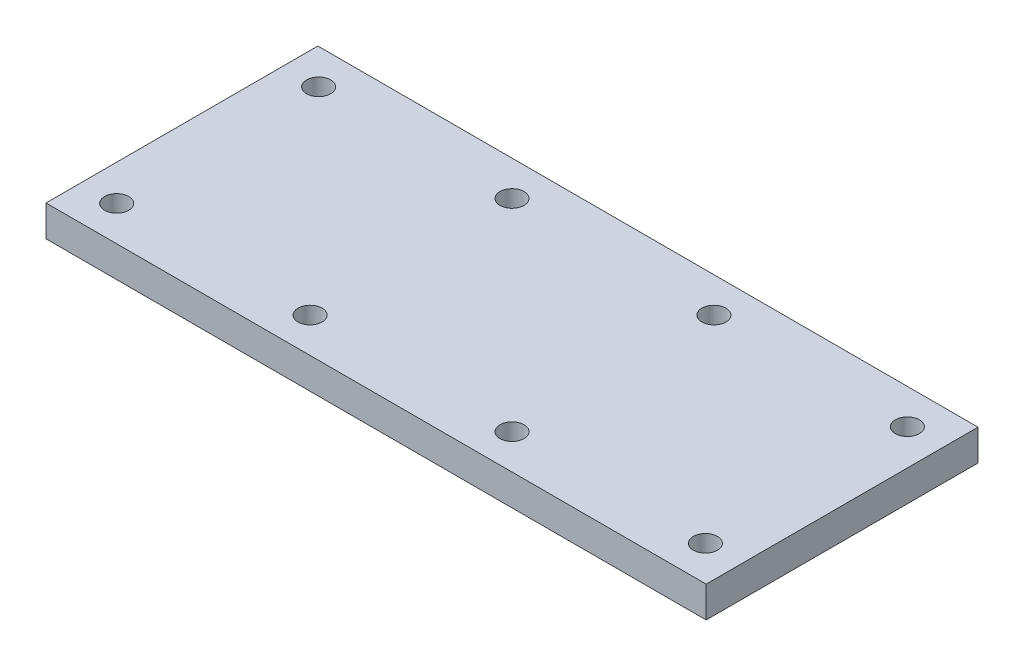
ISO-10303-21;
HEADER;
FILE_DESCRIPTION(('STEP AP214'),'2;1');
FILE_NAME('part.step','',(''),(''),'','','');
FILE_SCHEMA(('AUTOMOTIVE_DESIGN { 1 0 10303 214 1 1 1 1 }'));
ENDSEC;
DATA;
#1=APPLICATION_CONTEXT('core data for automotive mechanical design processes');
#2=APPLICATION_PROTOCOL_DEFINITION('international standard','automotive_design',2000,#1);
#3=PRODUCT_CONTEXT('',#1,'mechanical');
#4=PRODUCT('Part','Part','',(#3));
#5=PRODUCT_RELATED_PRODUCT_CATEGORY('part','',(#4));
#6=PRODUCT_DEFINITION_FORMATION('','',#4);
#7=PRODUCT_DEFINITION_CONTEXT('part definition',#1,'design');
#8=PRODUCT_DEFINITION('design','',#6,#7);
#9=PRODUCT_DEFINITION_SHAPE('','',#8);
#10=(LENGTH_UNIT() NAMED_UNIT(*) SI_UNIT(.MILLI.,.METRE.));
#11=(NAMED_UNIT(*) PLANE_ANGLE_UNIT() SI_UNIT($,.RADIAN.));
#12=(NAMED_UNIT(*) SI_UNIT($,.STERADIAN.) SOLID_ANGLE_UNIT());
#13=UNCERTAINTY_MEASURE_WITH_UNIT(LENGTH_MEASURE(1.E-05),#10,'distance_accuracy_value','');
#14=(GEOMETRIC_REPRESENTATION_CONTEXT(3) GLOBAL_UNCERTAINTY_ASSIGNED_CONTEXT((#13)) GLOBAL_UNIT_ASSIGNED_CONTEXT((#10,
#11,#12)) REPRESENTATION_CONTEXT('',''));
#15=CARTESIAN_POINT('',(0.,0.,0.));
#16=DIRECTION('',(0.,0.,1.));
#17=DIRECTION('',(1.,0.,0.));
#18=AXIS2_PLACEMENT_3D('',#15,#16,#17);
#19=CARTESIAN_POINT('',(0.,4.,0.));
#20=DIRECTION('',(0.,-1.,0.));
#21=DIRECTION('',(0.,0.,-1.));
#22=AXIS2_PLACEMENT_3D('',#19,#20,#21);
#23=PLANE('',#22);
#24=DIRECTION('',(0.,0.,1.));
#25=VECTOR('',#24,1.);
#26=CARTESIAN_POINT('',(0.,4.,0.));
#27=LINE('',#26,#25);
#28=CARTESIAN_POINT('',(0.,4.,-35.));
#29=VERTEX_POINT('',#28);
#30=CARTESIAN_POINT('',(0.,4.,0.));
#31=VERTEX_POINT('',#30);
#32=EDGE_CURVE('E92',#29,#31,#27,.T.);
#33=ORIENTED_EDGE('',*,*,#32,.T.);
#34=DIRECTION('',(1.,0.,0.));
#35=VECTOR('',#34,1.);
#36=CARTESIAN_POINT('',(0.,4.,0.));
#37=LINE('',#36,#35);
#38=CARTESIAN_POINT('',(85.,4.,0.));
#39=VERTEX_POINT('',#38);
#40=EDGE_CURVE('E87',#31,#39,#37,.T.);
#41=ORIENTED_EDGE('',*,*,#40,.T.);
#42=DIRECTION('',(0.,0.,-1.));
#43=VECTOR('',#42,1.);
#44=CARTESIAN_POINT('',(85.,4.,0.));
#45=LINE('',#44,#43);
#46=CARTESIAN_POINT('',(85.,4.,-35.));
#47=VERTEX_POINT('',#46);
#48=EDGE_CURVE('E90',#39,#47,#45,.T.);
#49=ORIENTED_EDGE('',*,*,#48,.T.);
#50=DIRECTION('',(-1.,0.,0.));
#51=VECTOR('',#50,1.);
#52=CARTESIAN_POINT('',(0.,4.,-35.));
#53=LINE('',#52,#51);
#54=EDGE_CURVE('E57',#47,#29,#53,.T.);
#55=ORIENTED_EDGE('',*,*,#54,.T.);
#56=EDGE_LOOP('',(#33,#41,#49,#55));
#57=FACE_BOUND('',#56,.T.);
#58=CARTESIAN_POINT('',(80.4,4.,-30.5));
#59=DIRECTION('',(0.,1.,0.));
#60=DIRECTION('',(0.,0.,1.));
#61=AXIS2_PLACEMENT_3D('',#58,#59,#60);
#62=CIRCLE('',#61,1.54999999999999);
#63=CARTESIAN_POINT('',(80.4,4.,-28.95));
#64=VERTEX_POINT('',#63);
#65=EDGE_CURVE('E112',#64,#64,#62,.T.);
#66=ORIENTED_EDGE('',*,*,#65,.F.);
#67=EDGE_LOOP('',(#66));
#68=FACE_BOUND('',#67,.T.);
#69=CARTESIAN_POINT('',(80.4,4.,-4.5));
#70=DIRECTION('',(0.,1.,0.));
#71=DIRECTION('',(0.,0.,-1.));
#72=AXIS2_PLACEMENT_3D('',#69,#70,#71);
#73=CIRCLE('',#72,1.54999999999999);
#74=CARTESIAN_POINT('',(80.4,4.,-6.05));
#75=VERTEX_POINT('',#74);
#76=EDGE_CURVE('E134',#75,#75,#73,.T.);
#77=ORIENTED_EDGE('',*,*,#76,.F.);
#78=EDGE_LOOP('',(#77));
#79=FACE_BOUND('',#78,.T.);
#80=CARTESIAN_POINT('',(4.60000000000001,4.,-30.5));
#81=DIRECTION('',(0.,1.,0.));
#82=DIRECTION('',(0.,0.,-1.));
#83=AXIS2_PLACEMENT_3D('',#80,#81,#82);
#84=CIRCLE('',#83,1.55);
#85=CARTESIAN_POINT('',(4.60000000000001,4.,-32.05));
#86=VERTEX_POINT('',#85);
#87=EDGE_CURVE('E142',#86,#86,#84,.T.);
#88=ORIENTED_EDGE('',*,*,#87,.F.);
#89=EDGE_LOOP('',(#88));
#90=FACE_BOUND('',#89,.T.);
#91=CARTESIAN_POINT('',(4.60000000000001,4.,-4.5));
#92=DIRECTION('',(0.,1.,0.));
#93=DIRECTION('',(0.,0.,1.));
#94=AXIS2_PLACEMENT_3D('',#91,#92,#93);
#95=CIRCLE('',#94,1.55);
#96=CARTESIAN_POINT('',(4.60000000000001,4.,-2.95));
#97=VERTEX_POINT('',#96);
#98=EDGE_CURVE('E150',#97,#97,#95,.T.);
#99=ORIENTED_EDGE('',*,*,#98,.F.);
#100=EDGE_LOOP('',(#99));
#101=FACE_BOUND('',#100,.T.);
#102=CARTESIAN_POINT('',(55.5,4.,-30.5));
#103=DIRECTION('',(0.,1.,0.));
#104=DIRECTION('',(0.,0.,1.));
#105=AXIS2_PLACEMENT_3D('',#102,#103,#104);
#106=CIRCLE('',#105,1.55);
#107=CARTESIAN_POINT('',(55.5,4.,-28.95));
#108=VERTEX_POINT('',#107);
#109=EDGE_CURVE('E158',#108,#108,#106,.T.);
#110=ORIENTED_EDGE('',*,*,#109,.F.);
#111=EDGE_LOOP('',(#110));
#112=FACE_BOUND('',#111,.T.);
#113=CARTESIAN_POINT('',(55.5,4.,-4.5));
#114=DIRECTION('',(0.,1.,0.));
#115=DIRECTION('',(0.,0.,-1.));
#116=AXIS2_PLACEMENT_3D('',#113,#114,#115);
#117=CIRCLE('',#116,1.55);
#118=CARTESIAN_POINT('',(55.5,4.,-6.05000000000001));
#119=VERTEX_POINT('',#118);
#120=EDGE_CURVE('E166',#119,#119,#117,.T.);
#121=ORIENTED_EDGE('',*,*,#120,.F.);
#122=EDGE_LOOP('',(#121));
#123=FACE_BOUND('',#122,.T.);
#124=CARTESIAN_POINT('',(29.5,4.,-4.5));
#125=DIRECTION('',(0.,1.,0.));
#126=DIRECTION('',(0.,0.,1.));
#127=AXIS2_PLACEMENT_3D('',#124,#125,#126);
#128=CIRCLE('',#127,1.55);
#129=CARTESIAN_POINT('',(29.5,4.,-2.95));
#130=VERTEX_POINT('',#129);
#131=EDGE_CURVE('E174',#130,#130,#128,.T.);
#132=ORIENTED_EDGE('',*,*,#131,.F.);
#133=EDGE_LOOP('',(#132));
#134=FACE_BOUND('',#133,.T.);
#135=CARTESIAN_POINT('',(29.5,4.,-30.5));
#136=DIRECTION('',(0.,1.,0.));
#137=DIRECTION('',(0.,0.,-1.));
#138=AXIS2_PLACEMENT_3D('',#135,#136,#137);
#139=CIRCLE('',#138,1.55);
#140=CARTESIAN_POINT('',(29.5,4.,-32.05));
#141=VERTEX_POINT('',#140);
#142=EDGE_CURVE('E182',#141,#141,#139,.T.);
#143=ORIENTED_EDGE('',*,*,#142,.F.);
#144=EDGE_LOOP('',(#143));
#145=FACE_BOUND('',#144,.T.);
#146=ADVANCED_FACE('F39',(#57,#68,#79,#90,#101,#112,#123,#134,#145),#23,.F.);
#147=CARTESIAN_POINT('',(0.,0.,0.));
#148=DIRECTION('',(0.,-1.,0.));
#149=DIRECTION('',(0.,0.,-1.));
#150=AXIS2_PLACEMENT_3D('',#147,#148,#149);
#151=PLANE('',#150);
#152=CARTESIAN_POINT('',(29.5,0.,-4.5));
#153=DIRECTION('',(0.,1.,0.));
#154=DIRECTION('',(0.,0.,1.));
#155=AXIS2_PLACEMENT_3D('',#152,#153,#154);
#156=CIRCLE('',#155,1.55);
#157=CARTESIAN_POINT('',(29.5,0.,-2.95));
#158=VERTEX_POINT('',#157);
#159=EDGE_CURVE('E178',#158,#158,#156,.T.);
#160=ORIENTED_EDGE('',*,*,#159,.T.);
#161=EDGE_LOOP('',(#160));
#162=FACE_BOUND('',#161,.T.);
#163=CARTESIAN_POINT('',(55.5,0.,-30.5));
#164=DIRECTION('',(0.,1.,0.));
#165=DIRECTION('',(0.,0.,1.));
#166=AXIS2_PLACEMENT_3D('',#163,#164,#165);
#167=CIRCLE('',#166,1.55);
#168=CARTESIAN_POINT('',(55.5,0.,-28.95));
#169=VERTEX_POINT('',#168);
#170=EDGE_CURVE('E162',#169,#169,#167,.T.);
#171=ORIENTED_EDGE('',*,*,#170,.T.);
#172=EDGE_LOOP('',(#171));
#173=FACE_BOUND('',#172,.T.);
#174=CARTESIAN_POINT('',(4.60000000000001,0.,-30.5));
#175=DIRECTION('',(0.,1.,0.));
#176=DIRECTION('',(0.,0.,-1.));
#177=AXIS2_PLACEMENT_3D('',#174,#175,#176);
#178=CIRCLE('',#177,1.55);
#179=CARTESIAN_POINT('',(4.60000000000001,0.,-32.05));
#180=VERTEX_POINT('',#179);
#181=EDGE_CURVE('E146',#180,#180,#178,.T.);
#182=ORIENTED_EDGE('',*,*,#181,.T.);
#183=EDGE_LOOP('',(#182));
#184=FACE_BOUND('',#183,.T.);
#185=CARTESIAN_POINT('',(80.4,0.,-30.5));
#186=DIRECTION('',(0.,1.,0.));
#187=DIRECTION('',(0.,0.,1.));
#188=AXIS2_PLACEMENT_3D('',#185,#186,#187);
#189=CIRCLE('',#188,1.54999999999999);
#190=CARTESIAN_POINT('',(80.4,0.,-28.95));
#191=VERTEX_POINT('',#190);
#192=EDGE_CURVE('E130',#191,#191,#189,.T.);
#193=ORIENTED_EDGE('',*,*,#192,.T.);
#194=EDGE_LOOP('',(#193));
#195=FACE_BOUND('',#194,.T.);
#196=DIRECTION('',(0.,0.,1.));
#197=VECTOR('',#196,1.);
#198=CARTESIAN_POINT('',(0.,0.,0.));
#199=LINE('',#198,#197);
#200=CARTESIAN_POINT('',(0.,0.,-35.));
#201=VERTEX_POINT('',#200);
#202=CARTESIAN_POINT('',(0.,0.,0.));
#203=VERTEX_POINT('',#202);
#204=EDGE_CURVE('E108',#201,#203,#199,.T.);
#205=ORIENTED_EDGE('',*,*,#204,.F.);
#206=DIRECTION('',(-1.,0.,0.));
#207=VECTOR('',#206,1.);
#208=CARTESIAN_POINT('',(0.,0.,-35.));
#209=LINE('',#208,#207);
#210=CARTESIAN_POINT('',(85.,0.,-35.));
#211=VERTEX_POINT('',#210);
#212=EDGE_CURVE('E80',#211,#201,#209,.T.);
#213=ORIENTED_EDGE('',*,*,#212,.F.);
#214=DIRECTION('',(0.,0.,-1.));
#215=VECTOR('',#214,1.);
#216=CARTESIAN_POINT('',(85.,0.,0.));
#217=LINE('',#216,#215);
#218=CARTESIAN_POINT('',(85.,0.,0.));
#219=VERTEX_POINT('',#218);
#220=EDGE_CURVE('E74',#219,#211,#217,.T.);
#221=ORIENTED_EDGE('',*,*,#220,.F.);
#222=DIRECTION('',(1.,0.,0.));
#223=VECTOR('',#222,1.);
#224=CARTESIAN_POINT('',(0.,0.,0.));
#225=LINE('',#224,#223);
#226=EDGE_CURVE('E97',#203,#219,#225,.T.);
#227=ORIENTED_EDGE('',*,*,#226,.F.);
#228=EDGE_LOOP('',(#205,#213,#221,#227));
#229=FACE_BOUND('',#228,.T.);
#230=CARTESIAN_POINT('',(80.4,0.,-4.5));
#231=DIRECTION('',(0.,1.,0.));
#232=DIRECTION('',(0.,0.,-1.));
#233=AXIS2_PLACEMENT_3D('',#230,#231,#232);
#234=CIRCLE('',#233,1.54999999999999);
#235=CARTESIAN_POINT('',(80.4,0.,-6.05));
#236=VERTEX_POINT('',#235);
#237=EDGE_CURVE('E138',#236,#236,#234,.T.);
#238=ORIENTED_EDGE('',*,*,#237,.T.);
#239=EDGE_LOOP('',(#238));
#240=FACE_BOUND('',#239,.T.);
#241=CARTESIAN_POINT('',(4.60000000000001,0.,-4.5));
#242=DIRECTION('',(0.,1.,0.));
#243=DIRECTION('',(0.,0.,1.));
#244=AXIS2_PLACEMENT_3D('',#241,#242,#243);
#245=CIRCLE('',#244,1.55);
#246=CARTESIAN_POINT('',(4.60000000000001,0.,-2.95));
#247=VERTEX_POINT('',#246);
#248=EDGE_CURVE('E154',#247,#247,#245,.T.);
#249=ORIENTED_EDGE('',*,*,#248,.T.);
#250=EDGE_LOOP('',(#249));
#251=FACE_BOUND('',#250,.T.);
#252=CARTESIAN_POINT('',(55.5,0.,-4.5));
#253=DIRECTION('',(0.,1.,0.));
#254=DIRECTION('',(0.,0.,-1.));
#255=AXIS2_PLACEMENT_3D('',#252,#253,#254);
#256=CIRCLE('',#255,1.55);
#257=CARTESIAN_POINT('',(55.5,0.,-6.05000000000001));
#258=VERTEX_POINT('',#257);
#259=EDGE_CURVE('E170',#258,#258,#256,.T.);
#260=ORIENTED_EDGE('',*,*,#259,.T.);
#261=EDGE_LOOP('',(#260));
#262=FACE_BOUND('',#261,.T.);
#263=CARTESIAN_POINT('',(29.5,0.,-30.5));
#264=DIRECTION('',(0.,1.,0.));
#265=DIRECTION('',(0.,0.,-1.));
#266=AXIS2_PLACEMENT_3D('',#263,#264,#265);
#267=CIRCLE('',#266,1.55);
#268=CARTESIAN_POINT('',(29.5,0.,-32.05));
#269=VERTEX_POINT('',#268);
#270=EDGE_CURVE('E186',#269,#269,#267,.T.);
#271=ORIENTED_EDGE('',*,*,#270,.T.);
#272=EDGE_LOOP('',(#271));
#273=FACE_BOUND('',#272,.T.);
#274=ADVANCED_FACE('F125',(#162,#173,#184,#195,#229,#240,#251,#262,#273),#151,.T.);
#275=CARTESIAN_POINT('',(0.,4.,0.));
#276=DIRECTION('',(1.,0.,0.));
#277=DIRECTION('',(0.,0.,-1.));
#278=AXIS2_PLACEMENT_3D('',#275,#276,#277);
#279=PLANE('',#278);
#280=ORIENTED_EDGE('',*,*,#204,.T.);
#281=DIRECTION('',(0.,-1.,0.));
#282=VECTOR('',#281,1.);
#283=CARTESIAN_POINT('',(0.,4.,0.));
#284=LINE('',#283,#282);
#285=EDGE_CURVE('E11',#31,#203,#284,.T.);
#286=ORIENTED_EDGE('',*,*,#285,.F.);
#287=ORIENTED_EDGE('',*,*,#32,.F.);
#288=DIRECTION('',(0.,-1.,0.));
#289=VECTOR('',#288,1.);
#290=CARTESIAN_POINT('',(0.,4.,-35.));
#291=LINE('',#290,#289);
#292=EDGE_CURVE('E104',#29,#201,#291,.T.);
#293=ORIENTED_EDGE('',*,*,#292,.T.);
#294=EDGE_LOOP('',(#280,#286,#287,#293));
#295=FACE_BOUND('',#294,.T.);
#296=ADVANCED_FACE('F41',(#295),#279,.F.);
#297=CARTESIAN_POINT('',(0.,4.,0.));
#298=DIRECTION('',(0.,0.,-1.));
#299=DIRECTION('',(-1.,0.,0.));
#300=AXIS2_PLACEMENT_3D('',#297,#298,#299);
#301=PLANE('',#300);
#302=ORIENTED_EDGE('',*,*,#226,.T.);
#303=DIRECTION('',(0.,-1.,0.));
#304=VECTOR('',#303,1.);
#305=CARTESIAN_POINT('',(85.,4.,0.));
#306=LINE('',#305,#304);
#307=EDGE_CURVE('E49',#39,#219,#306,.T.);
#308=ORIENTED_EDGE('',*,*,#307,.F.);
#309=ORIENTED_EDGE('',*,*,#40,.F.);
#310=ORIENTED_EDGE('',*,*,#285,.T.);
#311=EDGE_LOOP('',(#302,#308,#309,#310));
#312=FACE_BOUND('',#311,.T.);
#313=ADVANCED_FACE('F96',(#312),#301,.F.);
#314=CARTESIAN_POINT('',(85.,4.,0.));
#315=DIRECTION('',(-1.,0.,0.));
#316=DIRECTION('',(0.,0.,1.));
#317=AXIS2_PLACEMENT_3D('',#314,#315,#316);
#318=PLANE('',#317);
#319=ORIENTED_EDGE('',*,*,#220,.T.);
#320=DIRECTION('',(0.,-1.,0.));
#321=VECTOR('',#320,1.);
#322=CARTESIAN_POINT('',(85.,4.,-35.));
#323=LINE('',#322,#321);
#324=EDGE_CURVE('E99',#47,#211,#323,.T.);
#325=ORIENTED_EDGE('',*,*,#324,.F.);
#326=ORIENTED_EDGE('',*,*,#48,.F.);
#327=ORIENTED_EDGE('',*,*,#307,.T.);
#328=EDGE_LOOP('',(#319,#325,#326,#327));
#329=FACE_BOUND('',#328,.T.);
#330=ADVANCED_FACE('F100',(#329),#318,.F.);
#331=CARTESIAN_POINT('',(0.,4.,-35.));
#332=DIRECTION('',(0.,0.,1.));
#333=DIRECTION('',(1.,0.,0.));
#334=AXIS2_PLACEMENT_3D('',#331,#332,#333);
#335=PLANE('',#334);
#336=ORIENTED_EDGE('',*,*,#212,.T.);
#337=ORIENTED_EDGE('',*,*,#292,.F.);
#338=ORIENTED_EDGE('',*,*,#54,.F.);
#339=ORIENTED_EDGE('',*,*,#324,.T.);
#340=EDGE_LOOP('',(#336,#337,#338,#339));
#341=FACE_BOUND('',#340,.T.);
#342=ADVANCED_FACE('F122',(#341),#335,.F.);
#343=CARTESIAN_POINT('',(80.4,4.,-30.5));
#344=DIRECTION('',(0.,-1.,0.));
#345=DIRECTION('',(0.,0.,-1.));
#346=AXIS2_PLACEMENT_3D('',#343,#344,#345);
#347=CYLINDRICAL_SURFACE('',#346,1.54999999999999);
#348=ORIENTED_EDGE('',*,*,#65,.T.);
#349=EDGE_LOOP('',(#348));
#350=FACE_BOUND('',#349,.T.);
#351=ORIENTED_EDGE('',*,*,#192,.F.);
#352=EDGE_LOOP('',(#351));
#353=FACE_BOUND('',#352,.T.);
#354=ADVANCED_FACE('F205',(#350,#353),#347,.F.);
#355=CARTESIAN_POINT('',(80.4,4.,-4.5));
#356=DIRECTION('',(0.,-1.,0.));
#357=DIRECTION('',(0.,0.,-1.));
#358=AXIS2_PLACEMENT_3D('',#355,#356,#357);
#359=CYLINDRICAL_SURFACE('',#358,1.54999999999999);
#360=ORIENTED_EDGE('',*,*,#76,.T.);
#361=EDGE_LOOP('',(#360));
#362=FACE_BOUND('',#361,.T.);
#363=ORIENTED_EDGE('',*,*,#237,.F.);
#364=EDGE_LOOP('',(#363));
#365=FACE_BOUND('',#364,.T.);
#366=ADVANCED_FACE('F251',(#362,#365),#359,.F.);
#367=CARTESIAN_POINT('',(4.60000000000001,4.,-30.5));
#368=DIRECTION('',(0.,-1.,0.));
#369=DIRECTION('',(0.,0.,-1.));
#370=AXIS2_PLACEMENT_3D('',#367,#368,#369);
#371=CYLINDRICAL_SURFACE('',#370,1.55);
#372=ORIENTED_EDGE('',*,*,#87,.T.);
#373=EDGE_LOOP('',(#372));
#374=FACE_BOUND('',#373,.T.);
#375=ORIENTED_EDGE('',*,*,#181,.F.);
#376=EDGE_LOOP('',(#375));
#377=FACE_BOUND('',#376,.T.);
#378=ADVANCED_FACE('F259',(#374,#377),#371,.F.);
#379=CARTESIAN_POINT('',(4.60000000000001,4.,-4.5));
#380=DIRECTION('',(0.,-1.,0.));
#381=DIRECTION('',(0.,0.,-1.));
#382=AXIS2_PLACEMENT_3D('',#379,#380,#381);
#383=CYLINDRICAL_SURFACE('',#382,1.55);
#384=ORIENTED_EDGE('',*,*,#98,.T.);
#385=EDGE_LOOP('',(#384));
#386=FACE_BOUND('',#385,.T.);
#387=ORIENTED_EDGE('',*,*,#248,.F.);
#388=EDGE_LOOP('',(#387));
#389=FACE_BOUND('',#388,.T.);
#390=ADVANCED_FACE('F267',(#386,#389),#383,.F.);
#391=CARTESIAN_POINT('',(55.5,4.,-30.5));
#392=DIRECTION('',(0.,-1.,0.));
#393=DIRECTION('',(0.,0.,-1.));
#394=AXIS2_PLACEMENT_3D('',#391,#392,#393);
#395=CYLINDRICAL_SURFACE('',#394,1.55);
#396=ORIENTED_EDGE('',*,*,#109,.T.);
#397=EDGE_LOOP('',(#396));
#398=FACE_BOUND('',#397,.T.);
#399=ORIENTED_EDGE('',*,*,#170,.F.);
#400=EDGE_LOOP('',(#399));
#401=FACE_BOUND('',#400,.T.);
#402=ADVANCED_FACE('F276',(#398,#401),#395,.F.);
#403=CARTESIAN_POINT('',(55.5,4.,-4.5));
#404=DIRECTION('',(0.,-1.,0.));
#405=DIRECTION('',(0.,0.,-1.));
#406=AXIS2_PLACEMENT_3D('',#403,#404,#405);
#407=CYLINDRICAL_SURFACE('',#406,1.55);
#408=ORIENTED_EDGE('',*,*,#120,.T.);
#409=EDGE_LOOP('',(#408));
#410=FACE_BOUND('',#409,.T.);
#411=ORIENTED_EDGE('',*,*,#259,.F.);
#412=EDGE_LOOP('',(#411));
#413=FACE_BOUND('',#412,.T.);
#414=ADVANCED_FACE('F285',(#410,#413),#407,.F.);
#415=CARTESIAN_POINT('',(29.5,4.,-4.5));
#416=DIRECTION('',(0.,-1.,0.));
#417=DIRECTION('',(0.,0.,-1.));
#418=AXIS2_PLACEMENT_3D('',#415,#416,#417);
#419=CYLINDRICAL_SURFACE('',#418,1.55);
#420=ORIENTED_EDGE('',*,*,#131,.T.);
#421=EDGE_LOOP('',(#420));
#422=FACE_BOUND('',#421,.T.);
#423=ORIENTED_EDGE('',*,*,#159,.F.);
#424=EDGE_LOOP('',(#423));
#425=FACE_BOUND('',#424,.T.);
#426=ADVANCED_FACE('F294',(#422,#425),#419,.F.);
#427=CARTESIAN_POINT('',(29.5,4.,-30.5));
#428=DIRECTION('',(0.,-1.,0.));
#429=DIRECTION('',(0.,0.,-1.));
#430=AXIS2_PLACEMENT_3D('',#427,#428,#429);
#431=CYLINDRICAL_SURFACE('',#430,1.55);
#432=ORIENTED_EDGE('',*,*,#142,.T.);
#433=EDGE_LOOP('',(#432));
#434=FACE_BOUND('',#433,.T.);
#435=ORIENTED_EDGE('',*,*,#270,.F.);
#436=EDGE_LOOP('',(#435));
#437=FACE_BOUND('',#436,.T.);
#438=ADVANCED_FACE('F194',(#434,#437),#431,.F.);
#439=CLOSED_SHELL('',(#146,#274,#296,#313,#330,#342,#354,#366,#378,#390,#402,#414,#426,#438));
#440=MANIFOLD_SOLID_BREP('B2',#439);
#441=ADVANCED_BREP_SHAPE_REPRESENTATION('',(#18,#440),#14);
#442=SHAPE_DEFINITION_REPRESENTATION(#9,#441);
ENDSEC;
END-ISO-10303-21;
